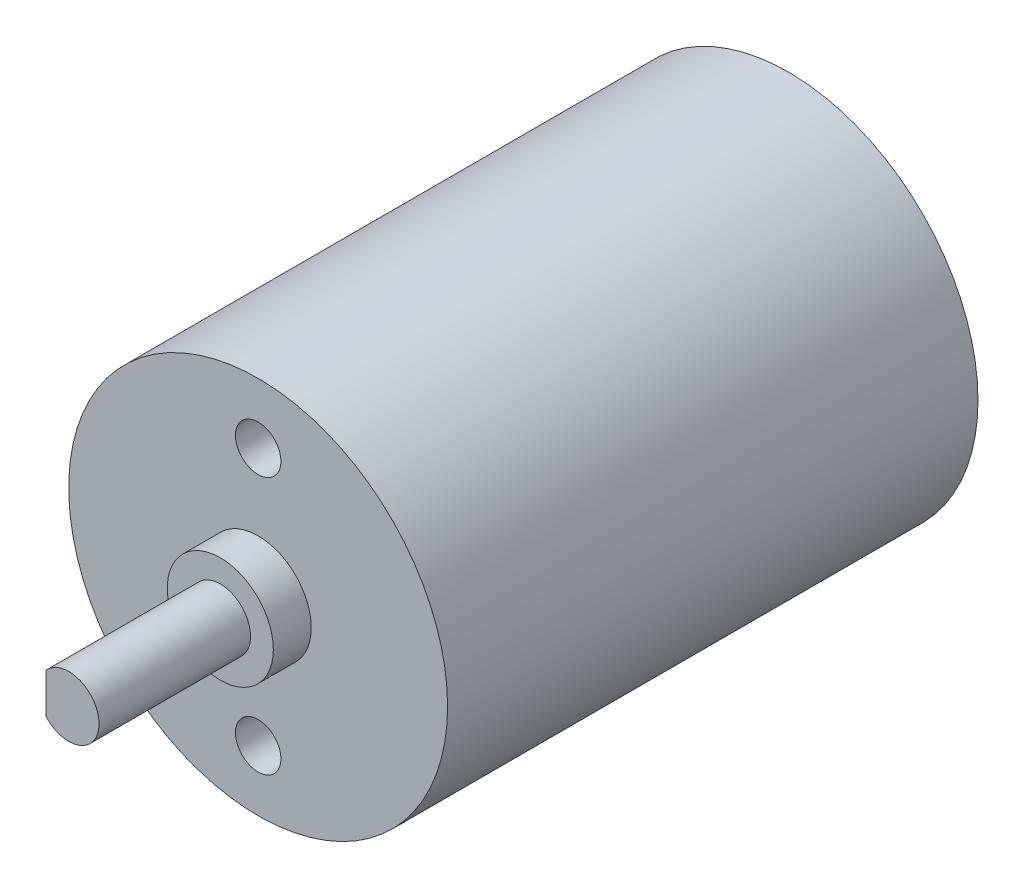
ISO-10303-21;
HEADER;
FILE_DESCRIPTION(('STEP AP214'),'2;1');
FILE_NAME('part.step','',(''),(''),'','','');
FILE_SCHEMA(('AUTOMOTIVE_DESIGN { 1 0 10303 214 1 1 1 1 }'));
ENDSEC;
DATA;
#1=APPLICATION_CONTEXT('core data for automotive mechanical design processes');
#2=APPLICATION_PROTOCOL_DEFINITION('international standard','automotive_design',2000,#1);
#3=PRODUCT_CONTEXT('',#1,'mechanical');
#4=PRODUCT('Part','Part','',(#3));
#5=PRODUCT_RELATED_PRODUCT_CATEGORY('part','',(#4));
#6=PRODUCT_DEFINITION_FORMATION('','',#4);
#7=PRODUCT_DEFINITION_CONTEXT('part definition',#1,'design');
#8=PRODUCT_DEFINITION('design','',#6,#7);
#9=PRODUCT_DEFINITION_SHAPE('','',#8);
#10=(LENGTH_UNIT() NAMED_UNIT(*) SI_UNIT(.MILLI.,.METRE.));
#11=(NAMED_UNIT(*) PLANE_ANGLE_UNIT() SI_UNIT($,.RADIAN.));
#12=(NAMED_UNIT(*) SI_UNIT($,.STERADIAN.) SOLID_ANGLE_UNIT());
#13=UNCERTAINTY_MEASURE_WITH_UNIT(LENGTH_MEASURE(1.E-05),#10,'distance_accuracy_value','');
#14=(GEOMETRIC_REPRESENTATION_CONTEXT(3) GLOBAL_UNCERTAINTY_ASSIGNED_CONTEXT((#13)) GLOBAL_UNIT_ASSIGNED_CONTEXT((#10,
#11,#12)) REPRESENTATION_CONTEXT('',''));
#15=CARTESIAN_POINT('',(0.,0.,0.));
#16=DIRECTION('',(0.,0.,1.));
#17=DIRECTION('',(1.,0.,0.));
#18=AXIS2_PLACEMENT_3D('',#15,#16,#17);
#19=CARTESIAN_POINT('',(0.,0.,35.));
#20=DIRECTION('',(0.,0.,-1.));
#21=DIRECTION('',(-1.,0.,0.));
#22=AXIS2_PLACEMENT_3D('',#19,#20,#21);
#23=CYLINDRICAL_SURFACE('',#22,12.5);
#24=CARTESIAN_POINT('',(0.,0.,35.));
#25=DIRECTION('',(0.,0.,1.));
#26=DIRECTION('',(1.,0.,0.));
#27=AXIS2_PLACEMENT_3D('',#24,#25,#26);
#28=CIRCLE('',#27,12.5);
#29=CARTESIAN_POINT('',(12.5,0.,35.));
#30=VERTEX_POINT('',#29);
#31=EDGE_CURVE('E87',#30,#30,#28,.T.);
#32=ORIENTED_EDGE('',*,*,#31,.F.);
#33=EDGE_LOOP('',(#32));
#34=FACE_BOUND('',#33,.T.);
#35=CARTESIAN_POINT('',(0.,0.,0.));
#36=DIRECTION('',(0.,0.,1.));
#37=DIRECTION('',(1.,0.,0.));
#38=AXIS2_PLACEMENT_3D('',#35,#36,#37);
#39=CIRCLE('',#38,12.5);
#40=CARTESIAN_POINT('',(12.5,0.,0.));
#41=VERTEX_POINT('',#40);
#42=EDGE_CURVE('E42',#41,#41,#39,.T.);
#43=ORIENTED_EDGE('',*,*,#42,.T.);
#44=EDGE_LOOP('',(#43));
#45=FACE_BOUND('',#44,.T.);
#46=ADVANCED_FACE('F39',(#34,#45),#23,.T.);
#47=CARTESIAN_POINT('',(0.,0.,35.));
#48=DIRECTION('',(0.,0.,1.));
#49=DIRECTION('',(1.,0.,0.));
#50=AXIS2_PLACEMENT_3D('',#47,#48,#49);
#51=PLANE('',#50);
#52=CARTESIAN_POINT('',(0.,8.5,35.));
#53=DIRECTION('',(0.,0.,1.));
#54=DIRECTION('',(1.,0.,0.));
#55=AXIS2_PLACEMENT_3D('',#52,#53,#54);
#56=CIRCLE('',#55,1.5);
#57=CARTESIAN_POINT('',(1.5,8.5,35.));
#58=VERTEX_POINT('',#57);
#59=EDGE_CURVE('E239',#58,#58,#56,.T.);
#60=ORIENTED_EDGE('',*,*,#59,.F.);
#61=EDGE_LOOP('',(#60));
#62=FACE_BOUND('',#61,.T.);
#63=CARTESIAN_POINT('',(0.,-8.5,35.));
#64=DIRECTION('',(0.,0.,1.));
#65=DIRECTION('',(1.,0.,0.));
#66=AXIS2_PLACEMENT_3D('',#63,#64,#65);
#67=CIRCLE('',#66,1.5);
#68=CARTESIAN_POINT('',(1.49999999999994,-8.5,35.));
#69=VERTEX_POINT('',#68);
#70=EDGE_CURVE('E242',#69,#69,#67,.T.);
#71=ORIENTED_EDGE('',*,*,#70,.F.);
#72=EDGE_LOOP('',(#71));
#73=FACE_BOUND('',#72,.T.);
#74=CARTESIAN_POINT('',(0.,0.,35.));
#75=DIRECTION('',(0.,0.,1.));
#76=DIRECTION('',(1.,0.,0.));
#77=AXIS2_PLACEMENT_3D('',#74,#75,#76);
#78=CIRCLE('',#77,3.5);
#79=CARTESIAN_POINT('',(3.5,0.,35.));
#80=VERTEX_POINT('',#79);
#81=EDGE_CURVE('E47',#80,#80,#78,.T.);
#82=ORIENTED_EDGE('',*,*,#81,.F.);
#83=EDGE_LOOP('',(#82));
#84=FACE_BOUND('',#83,.T.);
#85=ORIENTED_EDGE('',*,*,#31,.T.);
#86=EDGE_LOOP('',(#85));
#87=FACE_BOUND('',#86,.T.);
#88=ADVANCED_FACE('F98',(#62,#73,#84,#87),#51,.T.);
#89=CARTESIAN_POINT('',(0.,0.,0.));
#90=DIRECTION('',(0.,0.,1.));
#91=DIRECTION('',(1.,0.,0.));
#92=AXIS2_PLACEMENT_3D('',#89,#90,#91);
#93=PLANE('',#92);
#94=ORIENTED_EDGE('',*,*,#42,.F.);
#95=EDGE_LOOP('',(#94));
#96=FACE_BOUND('',#95,.T.);
#97=ADVANCED_FACE('F95',(#96),#93,.F.);
#98=CARTESIAN_POINT('',(0.,0.,37.5));
#99=DIRECTION('',(0.,0.,-1.));
#100=DIRECTION('',(-1.,0.,0.));
#101=AXIS2_PLACEMENT_3D('',#98,#99,#100);
#102=CYLINDRICAL_SURFACE('',#101,3.5);
#103=CARTESIAN_POINT('',(0.,0.,37.5));
#104=DIRECTION('',(0.,0.,1.));
#105=DIRECTION('',(1.,0.,0.));
#106=AXIS2_PLACEMENT_3D('',#103,#104,#105);
#107=CIRCLE('',#106,3.5);
#108=CARTESIAN_POINT('',(3.5,0.,37.5));
#109=VERTEX_POINT('',#108);
#110=EDGE_CURVE('E79',#109,#109,#107,.T.);
#111=ORIENTED_EDGE('',*,*,#110,.F.);
#112=EDGE_LOOP('',(#111));
#113=FACE_BOUND('',#112,.T.);
#114=ORIENTED_EDGE('',*,*,#81,.T.);
#115=EDGE_LOOP('',(#114));
#116=FACE_BOUND('',#115,.T.);
#117=ADVANCED_FACE('F97',(#113,#116),#102,.T.);
#118=CARTESIAN_POINT('',(0.,0.,37.5));
#119=DIRECTION('',(0.,0.,1.));
#120=DIRECTION('',(1.,0.,0.));
#121=AXIS2_PLACEMENT_3D('',#118,#119,#120);
#122=PLANE('',#121);
#123=CARTESIAN_POINT('',(0.,0.,37.5));
#124=DIRECTION('',(0.,0.,1.));
#125=DIRECTION('',(1.,0.,0.));
#126=AXIS2_PLACEMENT_3D('',#123,#124,#125);
#127=CIRCLE('',#126,2.);
#128=CARTESIAN_POINT('',(-1.5,-1.3228756555323,37.5));
#129=VERTEX_POINT('',#128);
#130=CARTESIAN_POINT('',(-1.5,1.3228756555323,37.5));
#131=VERTEX_POINT('',#130);
#132=EDGE_CURVE('E11',#129,#131,#127,.T.);
#133=ORIENTED_EDGE('',*,*,#132,.F.);
#134=DIRECTION('',(0.,-1.,0.));
#135=VECTOR('',#134,1.);
#136=CARTESIAN_POINT('',(-1.5,1.3228756555323,37.5));
#137=LINE('',#136,#135);
#138=EDGE_CURVE('E60',#131,#129,#137,.T.);
#139=ORIENTED_EDGE('',*,*,#138,.F.);
#140=EDGE_LOOP('',(#133,#139));
#141=FACE_BOUND('',#140,.T.);
#142=ORIENTED_EDGE('',*,*,#110,.T.);
#143=EDGE_LOOP('',(#142));
#144=FACE_BOUND('',#143,.T.);
#145=ADVANCED_FACE('F103',(#141,#144),#122,.T.);
#146=CARTESIAN_POINT('',(0.,0.,47.5));
#147=DIRECTION('',(0.,0.,-1.));
#148=DIRECTION('',(-1.,0.,0.));
#149=AXIS2_PLACEMENT_3D('',#146,#147,#148);
#150=CYLINDRICAL_SURFACE('',#149,2.);
#151=CARTESIAN_POINT('',(0.,0.,47.5));
#152=DIRECTION('',(0.,0.,1.));
#153=DIRECTION('',(1.,0.,0.));
#154=AXIS2_PLACEMENT_3D('',#151,#152,#153);
#155=CIRCLE('',#154,2.);
#156=CARTESIAN_POINT('',(-1.5,-1.3228756555323,47.5));
#157=VERTEX_POINT('',#156);
#158=CARTESIAN_POINT('',(-1.5,1.3228756555323,47.5));
#159=VERTEX_POINT('',#158);
#160=EDGE_CURVE('E75',#157,#159,#155,.T.);
#161=ORIENTED_EDGE('',*,*,#160,.F.);
#162=DIRECTION('',(0.,0.,1.));
#163=VECTOR('',#162,1.);
#164=CARTESIAN_POINT('',(-1.5,-1.3228756555323,34.8074175964328));
#165=LINE('',#164,#163);
#166=EDGE_CURVE('E55',#129,#157,#165,.T.);
#167=ORIENTED_EDGE('',*,*,#166,.F.);
#168=ORIENTED_EDGE('',*,*,#132,.T.);
#169=DIRECTION('',(0.,0.,1.));
#170=VECTOR('',#169,1.);
#171=CARTESIAN_POINT('',(-1.5,1.3228756555323,34.8074175964328));
#172=LINE('',#171,#170);
#173=EDGE_CURVE('E67',#131,#159,#172,.T.);
#174=ORIENTED_EDGE('',*,*,#173,.T.);
#175=EDGE_LOOP('',(#161,#167,#168,#174));
#176=FACE_BOUND('',#175,.T.);
#177=ADVANCED_FACE('F74',(#176),#150,.T.);
#178=CARTESIAN_POINT('',(0.,0.,47.5));
#179=DIRECTION('',(0.,0.,1.));
#180=DIRECTION('',(1.,0.,0.));
#181=AXIS2_PLACEMENT_3D('',#178,#179,#180);
#182=PLANE('',#181);
#183=DIRECTION('',(0.,1.,0.));
#184=VECTOR('',#183,1.);
#185=CARTESIAN_POINT('',(-1.5,1.3228756555323,47.5));
#186=LINE('',#185,#184);
#187=EDGE_CURVE('E64',#157,#159,#186,.T.);
#188=ORIENTED_EDGE('',*,*,#187,.F.);
#189=ORIENTED_EDGE('',*,*,#160,.T.);
#190=EDGE_LOOP('',(#188,#189));
#191=FACE_BOUND('',#190,.T.);
#192=ADVANCED_FACE('F78',(#191),#182,.T.);
#193=CARTESIAN_POINT('',(-1.5,1.3228756555323,34.8074175964328));
#194=DIRECTION('',(1.,0.,0.));
#195=DIRECTION('',(0.,0.,-1.));
#196=AXIS2_PLACEMENT_3D('',#193,#194,#195);
#197=PLANE('',#196);
#198=ORIENTED_EDGE('',*,*,#138,.T.);
#199=ORIENTED_EDGE('',*,*,#166,.T.);
#200=ORIENTED_EDGE('',*,*,#187,.T.);
#201=ORIENTED_EDGE('',*,*,#173,.F.);
#202=EDGE_LOOP('',(#198,#199,#200,#201));
#203=FACE_BOUND('',#202,.T.);
#204=ADVANCED_FACE('F66',(#203),#197,.F.);
#205=CARTESIAN_POINT('',(0.,-8.5,30.5));
#206=DIRECTION('',(0.,0.,1.));
#207=DIRECTION('',(1.,0.,0.));
#208=AXIS2_PLACEMENT_3D('',#205,#206,#207);
#209=CYLINDRICAL_SURFACE('',#208,1.5);
#210=CARTESIAN_POINT('',(0.,-8.5,30.5));
#211=DIRECTION('',(0.,0.,1.));
#212=DIRECTION('',(1.,0.,0.));
#213=AXIS2_PLACEMENT_3D('',#210,#211,#212);
#214=CIRCLE('',#213,1.5);
#215=CARTESIAN_POINT('',(1.49999999999994,-8.5,30.5));
#216=VERTEX_POINT('',#215);
#217=EDGE_CURVE('E247',#216,#216,#214,.T.);
#218=ORIENTED_EDGE('',*,*,#217,.F.);
#219=EDGE_LOOP('',(#218));
#220=FACE_BOUND('',#219,.T.);
#221=ORIENTED_EDGE('',*,*,#70,.T.);
#222=EDGE_LOOP('',(#221));
#223=FACE_BOUND('',#222,.T.);
#224=ADVANCED_FACE('F128',(#220,#223),#209,.F.);
#225=CARTESIAN_POINT('',(0.,-8.5,30.5));
#226=DIRECTION('',(0.,0.,1.));
#227=DIRECTION('',(1.,0.,0.));
#228=AXIS2_PLACEMENT_3D('',#225,#226,#227);
#229=PLANE('',#228);
#230=ORIENTED_EDGE('',*,*,#217,.T.);
#231=EDGE_LOOP('',(#230));
#232=FACE_BOUND('',#231,.T.);
#233=ADVANCED_FACE('F133',(#232),#229,.T.);
#234=CARTESIAN_POINT('',(0.,8.5,30.5));
#235=DIRECTION('',(0.,0.,1.));
#236=DIRECTION('',(1.,0.,0.));
#237=AXIS2_PLACEMENT_3D('',#234,#235,#236);
#238=CYLINDRICAL_SURFACE('',#237,1.5);
#239=CARTESIAN_POINT('',(0.,8.5,30.5));
#240=DIRECTION('',(0.,0.,1.));
#241=DIRECTION('',(1.,0.,0.));
#242=AXIS2_PLACEMENT_3D('',#239,#240,#241);
#243=CIRCLE('',#242,1.5);
#244=CARTESIAN_POINT('',(1.5,8.5,30.5));
#245=VERTEX_POINT('',#244);
#246=EDGE_CURVE('E71',#245,#245,#243,.T.);
#247=ORIENTED_EDGE('',*,*,#246,.F.);
#248=EDGE_LOOP('',(#247));
#249=FACE_BOUND('',#248,.T.);
#250=ORIENTED_EDGE('',*,*,#59,.T.);
#251=EDGE_LOOP('',(#250));
#252=FACE_BOUND('',#251,.T.);
#253=ADVANCED_FACE('F144',(#249,#252),#238,.F.);
#254=CARTESIAN_POINT('',(0.,8.5,30.5));
#255=DIRECTION('',(0.,0.,1.));
#256=DIRECTION('',(1.,0.,0.));
#257=AXIS2_PLACEMENT_3D('',#254,#255,#256);
#258=PLANE('',#257);
#259=ORIENTED_EDGE('',*,*,#246,.T.);
#260=EDGE_LOOP('',(#259));
#261=FACE_BOUND('',#260,.T.);
#262=ADVANCED_FACE('F155',(#261),#258,.T.);
#263=CLOSED_SHELL('',(#46,#88,#97,#117,#145,#177,#192,#204,#224,#233,#253,#262));
#264=MANIFOLD_SOLID_BREP('B2',#263);
#265=ADVANCED_BREP_SHAPE_REPRESENTATION('',(#18,#264),#14);
#266=SHAPE_DEFINITION_REPRESENTATION(#9,#265);
ENDSEC;
END-ISO-10303-21;
